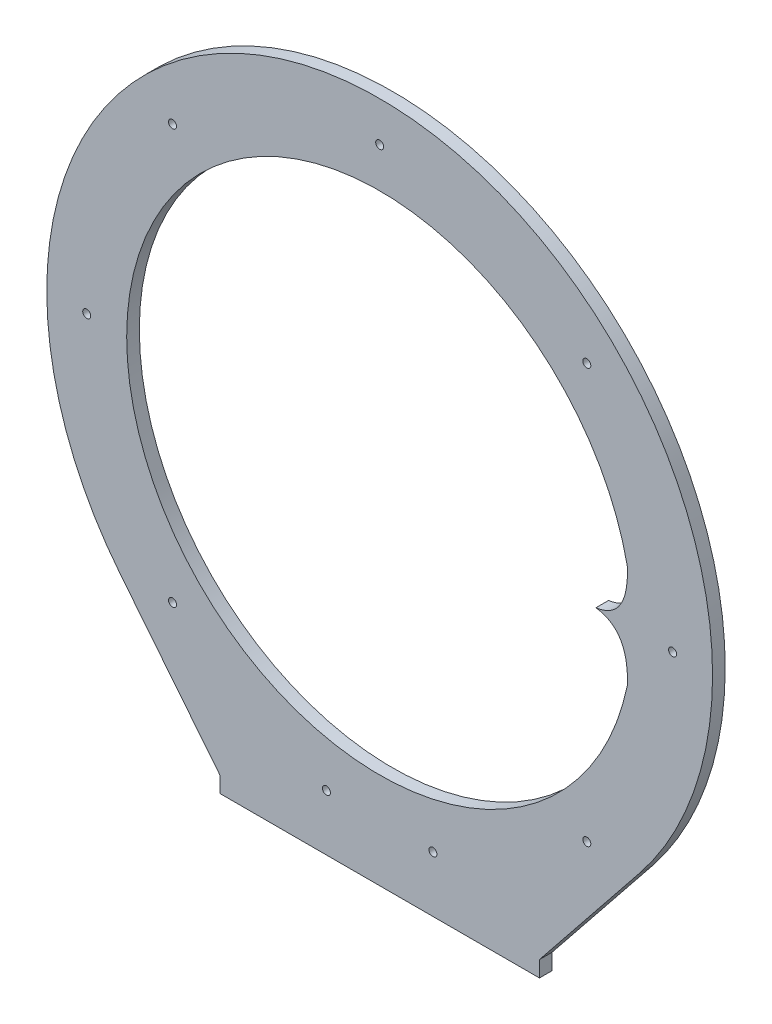
ISO-10303-21;
HEADER;
FILE_DESCRIPTION(('STEP AP214'),'2;1');
FILE_NAME('part.step','',(''),(''),'','','');
FILE_SCHEMA(('AUTOMOTIVE_DESIGN { 1 0 10303 214 1 1 1 1 }'));
ENDSEC;
DATA;
#1=APPLICATION_CONTEXT('core data for automotive mechanical design processes');
#2=APPLICATION_PROTOCOL_DEFINITION('international standard','automotive_design',2000,#1);
#3=PRODUCT_CONTEXT('',#1,'mechanical');
#4=PRODUCT('Part','Part','',(#3));
#5=PRODUCT_RELATED_PRODUCT_CATEGORY('part','',(#4));
#6=PRODUCT_DEFINITION_FORMATION('','',#4);
#7=PRODUCT_DEFINITION_CONTEXT('part definition',#1,'design');
#8=PRODUCT_DEFINITION('design','',#6,#7);
#9=PRODUCT_DEFINITION_SHAPE('','',#8);
#10=(LENGTH_UNIT() NAMED_UNIT(*) SI_UNIT(.MILLI.,.METRE.));
#11=(NAMED_UNIT(*) PLANE_ANGLE_UNIT() SI_UNIT($,.RADIAN.));
#12=(NAMED_UNIT(*) SI_UNIT($,.STERADIAN.) SOLID_ANGLE_UNIT());
#13=UNCERTAINTY_MEASURE_WITH_UNIT(LENGTH_MEASURE(1.E-05),#10,'distance_accuracy_value','');
#14=(GEOMETRIC_REPRESENTATION_CONTEXT(3) GLOBAL_UNCERTAINTY_ASSIGNED_CONTEXT((#13)) GLOBAL_UNIT_ASSIGNED_CONTEXT((#10,
#11,#12)) REPRESENTATION_CONTEXT('',''));
#15=CARTESIAN_POINT('',(0.,0.,0.));
#16=DIRECTION('',(0.,0.,1.));
#17=DIRECTION('',(1.,0.,0.));
#18=AXIS2_PLACEMENT_3D('',#15,#16,#17);
#19=CARTESIAN_POINT('',(93.0157704600136,-19.3149280539709,4.75));
#20=CARTESIAN_POINT('',(93.7028575700956,-1.72245204531406,4.75));
#21=CARTESIAN_POINT('',(81.1980074645598,0.,4.75));
#22=B_SPLINE_CURVE_WITH_KNOTS('',2,(#19,#20,#21),.UNSPECIFIED.,.F.,.F.,(3,3),(0.,1.),.UNSPECIFIED.);
#23=DIRECTION('',(0.,0.,-1.));
#24=VECTOR('',#23,1.);
#25=SURFACE_OF_LINEAR_EXTRUSION('',#22,#24);
#26=CARTESIAN_POINT('',(93.0157704600136,-19.3149280539709,0.));
#27=CARTESIAN_POINT('',(93.7028575700956,-1.72245204531406,0.));
#28=CARTESIAN_POINT('',(81.1980074645598,0.,0.));
#29=B_SPLINE_CURVE_WITH_KNOTS('',2,(#26,#27,#28),.UNSPECIFIED.,.F.,.F.,(3,3),(0.,1.),.UNSPECIFIED.);
#30=CARTESIAN_POINT('',(93.0157704600136,-19.3149280539709,0.));
#31=VERTEX_POINT('',#30);
#32=CARTESIAN_POINT('',(81.1980074645598,0.,0.));
#33=VERTEX_POINT('',#32);
#34=EDGE_CURVE('E130',#31,#33,#29,.T.);
#35=ORIENTED_EDGE('',*,*,#34,.F.);
#36=DIRECTION('',(0.,0.,-1.));
#37=VECTOR('',#36,1.);
#38=CARTESIAN_POINT('',(93.0157704600136,-19.3149280539709,4.75));
#39=LINE('',#38,#37);
#40=CARTESIAN_POINT('',(93.0157704600136,-19.3149280539709,4.75));
#41=VERTEX_POINT('',#40);
#42=EDGE_CURVE('E11',#41,#31,#39,.T.);
#43=ORIENTED_EDGE('',*,*,#42,.F.);
#44=CARTESIAN_POINT('',(81.1980074645598,0.,4.75));
#45=VERTEX_POINT('',#44);
#46=EDGE_CURVE('E128',#41,#45,#22,.T.);
#47=ORIENTED_EDGE('',*,*,#46,.T.);
#48=DIRECTION('',(0.,0.,-1.));
#49=VECTOR('',#48,1.);
#50=CARTESIAN_POINT('',(81.1980074645598,0.,4.75));
#51=LINE('',#50,#49);
#52=EDGE_CURVE('E104',#45,#33,#51,.T.);
#53=ORIENTED_EDGE('',*,*,#52,.T.);
#54=EDGE_LOOP('',(#35,#43,#47,#53));
#55=FACE_BOUND('',#54,.T.);
#56=ADVANCED_FACE('F49',(#55),#25,.T.);
#57=CARTESIAN_POINT('',(0.,0.,4.75));
#58=DIRECTION('',(0.,0.,-1.));
#59=DIRECTION('',(-1.,0.,0.));
#60=AXIS2_PLACEMENT_3D('',#57,#58,#59);
#61=CYLINDRICAL_SURFACE('',#60,95.);
#62=CARTESIAN_POINT('',(0.,0.,0.));
#63=DIRECTION('',(0.,0.,1.));
#64=DIRECTION('',(1.,0.,0.));
#65=AXIS2_PLACEMENT_3D('',#62,#63,#64);
#66=CIRCLE('',#65,95.);
#67=CARTESIAN_POINT('',(93.0157704600136,19.3149280539709,0.));
#68=VERTEX_POINT('',#67);
#69=EDGE_CURVE('E221',#68,#31,#66,.T.);
#70=ORIENTED_EDGE('',*,*,#69,.F.);
#71=DIRECTION('',(0.,0.,-1.));
#72=VECTOR('',#71,1.);
#73=CARTESIAN_POINT('',(93.0157704600136,19.3149280539709,4.75));
#74=LINE('',#73,#72);
#75=CARTESIAN_POINT('',(93.0157704600136,19.3149280539709,4.75));
#76=VERTEX_POINT('',#75);
#77=EDGE_CURVE('E59',#76,#68,#74,.T.);
#78=ORIENTED_EDGE('',*,*,#77,.F.);
#79=CARTESIAN_POINT('',(0.,0.,4.75));
#80=DIRECTION('',(0.,0.,1.));
#81=DIRECTION('',(1.,0.,0.));
#82=AXIS2_PLACEMENT_3D('',#79,#80,#81);
#83=CIRCLE('',#82,95.);
#84=EDGE_CURVE('E137',#76,#41,#83,.T.);
#85=ORIENTED_EDGE('',*,*,#84,.T.);
#86=ORIENTED_EDGE('',*,*,#42,.T.);
#87=EDGE_LOOP('',(#70,#78,#85,#86));
#88=FACE_BOUND('',#87,.T.);
#89=ADVANCED_FACE('F140',(#88),#61,.F.);
#90=CARTESIAN_POINT('',(97.5292587776334,-78.185955786736,4.75));
#91=DIRECTION('',(-0.780234070221067,0.625487646293888,0.));
#92=DIRECTION('',(-0.625487646293888,-0.780234070221067,0.));
#93=AXIS2_PLACEMENT_3D('',#90,#91,#92);
#94=PLANE('',#93);
#95=DIRECTION('',(0.625487646293888,0.780234070221067,0.));
#96=VECTOR('',#95,1.);
#97=CARTESIAN_POINT('',(97.5292587776334,-78.185955786736,0.));
#98=LINE('',#97,#96);
#99=CARTESIAN_POINT('',(60.0000000000001,-125.,0.));
#100=VERTEX_POINT('',#99);
#101=CARTESIAN_POINT('',(97.5292587776333,-78.1859557867361,0.));
#102=VERTEX_POINT('',#101);
#103=EDGE_CURVE('E200',#100,#102,#98,.T.);
#104=ORIENTED_EDGE('',*,*,#103,.T.);
#105=DIRECTION('',(0.,0.,-1.));
#106=VECTOR('',#105,1.);
#107=CARTESIAN_POINT('',(97.5292587776333,-78.1859557867361,4.75));
#108=LINE('',#107,#106);
#109=CARTESIAN_POINT('',(97.5292587776333,-78.1859557867361,4.75));
#110=VERTEX_POINT('',#109);
#111=EDGE_CURVE('E53',#110,#102,#108,.T.);
#112=ORIENTED_EDGE('',*,*,#111,.F.);
#113=DIRECTION('',(0.625487646293888,0.780234070221067,0.));
#114=VECTOR('',#113,1.);
#115=CARTESIAN_POINT('',(97.5292587776334,-78.185955786736,4.75));
#116=LINE('',#115,#114);
#117=CARTESIAN_POINT('',(60.0000000000001,-125.,4.75));
#118=VERTEX_POINT('',#117);
#119=EDGE_CURVE('E260',#118,#110,#116,.T.);
#120=ORIENTED_EDGE('',*,*,#119,.F.);
#121=DIRECTION('',(0.,0.,-1.));
#122=VECTOR('',#121,1.);
#123=CARTESIAN_POINT('',(60.0000000000001,-125.,4.75));
#124=LINE('',#123,#122);
#125=EDGE_CURVE('E263',#118,#100,#124,.T.);
#126=ORIENTED_EDGE('',*,*,#125,.T.);
#127=EDGE_LOOP('',(#104,#112,#120,#126));
#128=FACE_BOUND('',#127,.T.);
#129=ADVANCED_FACE('F51',(#128),#94,.F.);
#130=CARTESIAN_POINT('',(0.,0.,4.75));
#131=DIRECTION('',(0.,0.,-1.));
#132=DIRECTION('',(-1.,0.,0.));
#133=AXIS2_PLACEMENT_3D('',#130,#131,#132);
#134=CYLINDRICAL_SURFACE('',#133,125.);
#135=CARTESIAN_POINT('',(0.,0.,0.));
#136=DIRECTION('',(0.,0.,1.));
#137=DIRECTION('',(1.,0.,0.));
#138=AXIS2_PLACEMENT_3D('',#135,#136,#137);
#139=CIRCLE('',#138,125.);
#140=CARTESIAN_POINT('',(-97.5292587776333,-78.1859557867361,0.));
#141=VERTEX_POINT('',#140);
#142=EDGE_CURVE('E191',#102,#141,#139,.T.);
#143=ORIENTED_EDGE('',*,*,#142,.T.);
#144=DIRECTION('',(0.,0.,-1.));
#145=VECTOR('',#144,1.);
#146=CARTESIAN_POINT('',(-97.5292587776333,-78.1859557867361,4.75));
#147=LINE('',#146,#145);
#148=CARTESIAN_POINT('',(-97.5292587776333,-78.1859557867361,4.75));
#149=VERTEX_POINT('',#148);
#150=EDGE_CURVE('E193',#149,#141,#147,.T.);
#151=ORIENTED_EDGE('',*,*,#150,.F.);
#152=CARTESIAN_POINT('',(0.,0.,4.75));
#153=DIRECTION('',(0.,0.,1.));
#154=DIRECTION('',(1.,0.,0.));
#155=AXIS2_PLACEMENT_3D('',#152,#153,#154);
#156=CIRCLE('',#155,125.);
#157=EDGE_CURVE('E112',#110,#149,#156,.T.);
#158=ORIENTED_EDGE('',*,*,#157,.F.);
#159=ORIENTED_EDGE('',*,*,#111,.T.);
#160=EDGE_LOOP('',(#143,#151,#158,#159));
#161=FACE_BOUND('',#160,.T.);
#162=ADVANCED_FACE('F183',(#161),#134,.T.);
#163=CARTESIAN_POINT('',(-97.5292587776332,-78.1859557867361,4.75));
#164=DIRECTION('',(-0.780234070221066,-0.625487646293889,0.));
#165=DIRECTION('',(0.625487646293889,-0.780234070221066,0.));
#166=AXIS2_PLACEMENT_3D('',#163,#164,#165);
#167=PLANE('',#166);
#168=DIRECTION('',(-0.625487646293889,0.780234070221066,0.));
#169=VECTOR('',#168,1.);
#170=CARTESIAN_POINT('',(-97.5292587776332,-78.1859557867361,0.));
#171=LINE('',#170,#169);
#172=CARTESIAN_POINT('',(-59.9999999999999,-125.,0.));
#173=VERTEX_POINT('',#172);
#174=EDGE_CURVE('E199',#173,#141,#171,.T.);
#175=ORIENTED_EDGE('',*,*,#174,.F.);
#176=DIRECTION('',(0.,0.,-1.));
#177=VECTOR('',#176,1.);
#178=CARTESIAN_POINT('',(-59.9999999999999,-125.,4.75));
#179=LINE('',#178,#177);
#180=CARTESIAN_POINT('',(-59.9999999999999,-125.,4.75));
#181=VERTEX_POINT('',#180);
#182=EDGE_CURVE('E271',#181,#173,#179,.T.);
#183=ORIENTED_EDGE('',*,*,#182,.F.);
#184=DIRECTION('',(-0.625487646293889,0.780234070221066,0.));
#185=VECTOR('',#184,1.);
#186=CARTESIAN_POINT('',(-97.5292587776332,-78.1859557867361,4.75));
#187=LINE('',#186,#185);
#188=EDGE_CURVE('E273',#181,#149,#187,.T.);
#189=ORIENTED_EDGE('',*,*,#188,.T.);
#190=ORIENTED_EDGE('',*,*,#150,.T.);
#191=EDGE_LOOP('',(#175,#183,#189,#190));
#192=FACE_BOUND('',#191,.T.);
#193=ADVANCED_FACE('F180',(#192),#167,.T.);
#194=CARTESIAN_POINT('',(-59.9999999999999,0.,4.75));
#195=DIRECTION('',(1.,0.,0.));
#196=DIRECTION('',(0.,0.,-1.));
#197=AXIS2_PLACEMENT_3D('',#194,#195,#196);
#198=PLANE('',#197);
#199=DIRECTION('',(0.,-1.,0.));
#200=VECTOR('',#199,1.);
#201=CARTESIAN_POINT('',(-59.9999999999999,0.,0.));
#202=LINE('',#201,#200);
#203=CARTESIAN_POINT('',(-59.9999999999999,-131.,0.));
#204=VERTEX_POINT('',#203);
#205=EDGE_CURVE('E207',#173,#204,#202,.T.);
#206=ORIENTED_EDGE('',*,*,#205,.T.);
#207=DIRECTION('',(0.,0.,-1.));
#208=VECTOR('',#207,1.);
#209=CARTESIAN_POINT('',(-59.9999999999999,-131.,4.75));
#210=LINE('',#209,#208);
#211=CARTESIAN_POINT('',(-59.9999999999999,-131.,4.75));
#212=VERTEX_POINT('',#211);
#213=EDGE_CURVE('E268',#212,#204,#210,.T.);
#214=ORIENTED_EDGE('',*,*,#213,.F.);
#215=DIRECTION('',(0.,-1.,0.));
#216=VECTOR('',#215,1.);
#217=CARTESIAN_POINT('',(-59.9999999999999,0.,4.75));
#218=LINE('',#217,#216);
#219=EDGE_CURVE('E276',#181,#212,#218,.T.);
#220=ORIENTED_EDGE('',*,*,#219,.F.);
#221=ORIENTED_EDGE('',*,*,#182,.T.);
#222=EDGE_LOOP('',(#206,#214,#220,#221));
#223=FACE_BOUND('',#222,.T.);
#224=ADVANCED_FACE('F176',(#223),#198,.F.);
#225=CARTESIAN_POINT('',(0.,-131.,4.75));
#226=DIRECTION('',(0.,1.,0.));
#227=DIRECTION('',(0.,0.,1.));
#228=AXIS2_PLACEMENT_3D('',#225,#226,#227);
#229=PLANE('',#228);
#230=DIRECTION('',(1.,0.,0.));
#231=VECTOR('',#230,1.);
#232=CARTESIAN_POINT('',(0.,-131.,0.));
#233=LINE('',#232,#231);
#234=CARTESIAN_POINT('',(60.0000000000001,-131.,0.));
#235=VERTEX_POINT('',#234);
#236=EDGE_CURVE('E209',#204,#235,#233,.T.);
#237=ORIENTED_EDGE('',*,*,#236,.T.);
#238=DIRECTION('',(0.,0.,-1.));
#239=VECTOR('',#238,1.);
#240=CARTESIAN_POINT('',(60.0000000000001,-131.,4.75));
#241=LINE('',#240,#239);
#242=CARTESIAN_POINT('',(60.0000000000001,-131.,4.75));
#243=VERTEX_POINT('',#242);
#244=EDGE_CURVE('E265',#243,#235,#241,.T.);
#245=ORIENTED_EDGE('',*,*,#244,.F.);
#246=DIRECTION('',(1.,0.,0.));
#247=VECTOR('',#246,1.);
#248=CARTESIAN_POINT('',(0.,-131.,4.75));
#249=LINE('',#248,#247);
#250=EDGE_CURVE('E278',#212,#243,#249,.T.);
#251=ORIENTED_EDGE('',*,*,#250,.F.);
#252=ORIENTED_EDGE('',*,*,#213,.T.);
#253=EDGE_LOOP('',(#237,#245,#251,#252));
#254=FACE_BOUND('',#253,.T.);
#255=ADVANCED_FACE('F172',(#254),#229,.F.);
#256=CARTESIAN_POINT('',(-20.,-110.,4.75));
#257=DIRECTION('',(0.,0.,-1.));
#258=DIRECTION('',(-1.,0.,0.));
#259=AXIS2_PLACEMENT_3D('',#256,#257,#258);
#260=CYLINDRICAL_SURFACE('',#259,1.5);
#261=CARTESIAN_POINT('',(-20.,-110.,4.75));
#262=DIRECTION('',(0.,0.,1.));
#263=DIRECTION('',(1.,0.,0.));
#264=AXIS2_PLACEMENT_3D('',#261,#262,#263);
#265=CIRCLE('',#264,1.5);
#266=CARTESIAN_POINT('',(-18.5,-110.,4.75));
#267=VERTEX_POINT('',#266);
#268=EDGE_CURVE('E293',#267,#267,#265,.T.);
#269=ORIENTED_EDGE('',*,*,#268,.T.);
#270=EDGE_LOOP('',(#269));
#271=FACE_BOUND('',#270,.T.);
#272=CARTESIAN_POINT('',(-20.,-110.,0.));
#273=DIRECTION('',(0.,0.,1.));
#274=DIRECTION('',(1.,0.,0.));
#275=AXIS2_PLACEMENT_3D('',#272,#273,#274);
#276=CIRCLE('',#275,1.5);
#277=CARTESIAN_POINT('',(-18.5,-110.,0.));
#278=VERTEX_POINT('',#277);
#279=EDGE_CURVE('E254',#278,#278,#276,.T.);
#280=ORIENTED_EDGE('',*,*,#279,.F.);
#281=EDGE_LOOP('',(#280));
#282=FACE_BOUND('',#281,.T.);
#283=ADVANCED_FACE('F175',(#271,#282),#260,.F.);
#284=CARTESIAN_POINT('',(-110.,0.,4.75));
#285=DIRECTION('',(0.,0.,-1.));
#286=DIRECTION('',(-1.,0.,0.));
#287=AXIS2_PLACEMENT_3D('',#284,#285,#286);
#288=CYLINDRICAL_SURFACE('',#287,1.5);
#289=CARTESIAN_POINT('',(-110.,0.,4.75));
#290=DIRECTION('',(0.,0.,1.));
#291=DIRECTION('',(1.,0.,0.));
#292=AXIS2_PLACEMENT_3D('',#289,#290,#291);
#293=CIRCLE('',#292,1.5);
#294=CARTESIAN_POINT('',(-108.5,0.,4.75));
#295=VERTEX_POINT('',#294);
#296=EDGE_CURVE('E296',#295,#295,#293,.F.);
#297=ORIENTED_EDGE('',*,*,#296,.F.);
#298=EDGE_LOOP('',(#297));
#299=FACE_BOUND('',#298,.T.);
#300=CARTESIAN_POINT('',(-110.,0.,0.));
#301=DIRECTION('',(0.,0.,1.));
#302=DIRECTION('',(1.,0.,0.));
#303=AXIS2_PLACEMENT_3D('',#300,#301,#302);
#304=CIRCLE('',#303,1.5);
#305=CARTESIAN_POINT('',(-108.5,0.,0.));
#306=VERTEX_POINT('',#305);
#307=EDGE_CURVE('E251',#306,#306,#304,.F.);
#308=ORIENTED_EDGE('',*,*,#307,.T.);
#309=EDGE_LOOP('',(#308));
#310=FACE_BOUND('',#309,.T.);
#311=ADVANCED_FACE('F352',(#299,#310),#288,.F.);
#312=CARTESIAN_POINT('',(110.,0.,4.75));
#313=DIRECTION('',(0.,0.,-1.));
#314=DIRECTION('',(-1.,0.,0.));
#315=AXIS2_PLACEMENT_3D('',#312,#313,#314);
#316=CYLINDRICAL_SURFACE('',#315,1.5);
#317=CARTESIAN_POINT('',(110.,0.,4.75));
#318=DIRECTION('',(0.,0.,1.));
#319=DIRECTION('',(1.,0.,0.));
#320=AXIS2_PLACEMENT_3D('',#317,#318,#319);
#321=CIRCLE('',#320,1.5);
#322=CARTESIAN_POINT('',(111.5,0.,4.75));
#323=VERTEX_POINT('',#322);
#324=EDGE_CURVE('E299',#323,#323,#321,.T.);
#325=ORIENTED_EDGE('',*,*,#324,.T.);
#326=EDGE_LOOP('',(#325));
#327=FACE_BOUND('',#326,.T.);
#328=CARTESIAN_POINT('',(110.,0.,0.));
#329=DIRECTION('',(0.,0.,1.));
#330=DIRECTION('',(1.,0.,0.));
#331=AXIS2_PLACEMENT_3D('',#328,#329,#330);
#332=CIRCLE('',#331,1.5);
#333=CARTESIAN_POINT('',(111.5,0.,0.));
#334=VERTEX_POINT('',#333);
#335=EDGE_CURVE('E248',#334,#334,#332,.T.);
#336=ORIENTED_EDGE('',*,*,#335,.F.);
#337=EDGE_LOOP('',(#336));
#338=FACE_BOUND('',#337,.T.);
#339=ADVANCED_FACE('F356',(#327,#338),#316,.F.);
#340=CARTESIAN_POINT('',(0.,110.,4.75));
#341=DIRECTION('',(0.,0.,-1.));
#342=DIRECTION('',(-1.,0.,0.));
#343=AXIS2_PLACEMENT_3D('',#340,#341,#342);
#344=CYLINDRICAL_SURFACE('',#343,1.5);
#345=CARTESIAN_POINT('',(0.,110.,4.75));
#346=DIRECTION('',(0.,0.,1.));
#347=DIRECTION('',(1.,0.,0.));
#348=AXIS2_PLACEMENT_3D('',#345,#346,#347);
#349=CIRCLE('',#348,1.5);
#350=CARTESIAN_POINT('',(1.5,110.,4.75));
#351=VERTEX_POINT('',#350);
#352=EDGE_CURVE('E302',#351,#351,#349,.F.);
#353=ORIENTED_EDGE('',*,*,#352,.F.);
#354=EDGE_LOOP('',(#353));
#355=FACE_BOUND('',#354,.T.);
#356=CARTESIAN_POINT('',(0.,110.,0.));
#357=DIRECTION('',(0.,0.,1.));
#358=DIRECTION('',(1.,0.,0.));
#359=AXIS2_PLACEMENT_3D('',#356,#357,#358);
#360=CIRCLE('',#359,1.5);
#361=CARTESIAN_POINT('',(1.5,110.,0.));
#362=VERTEX_POINT('',#361);
#363=EDGE_CURVE('E245',#362,#362,#360,.F.);
#364=ORIENTED_EDGE('',*,*,#363,.T.);
#365=EDGE_LOOP('',(#364));
#366=FACE_BOUND('',#365,.T.);
#367=ADVANCED_FACE('F360',(#355,#366),#344,.F.);
#368=CARTESIAN_POINT('',(77.7817459305203,-77.7817459305202,4.75));
#369=DIRECTION('',(0.,0.,-1.));
#370=DIRECTION('',(-1.,0.,0.));
#371=AXIS2_PLACEMENT_3D('',#368,#369,#370);
#372=CYLINDRICAL_SURFACE('',#371,1.5);
#373=CARTESIAN_POINT('',(77.7817459305203,-77.7817459305202,4.75));
#374=DIRECTION('',(0.,0.,1.));
#375=DIRECTION('',(1.,0.,0.));
#376=AXIS2_PLACEMENT_3D('',#373,#374,#375);
#377=CIRCLE('',#376,1.5);
#378=CARTESIAN_POINT('',(79.2817459305203,-77.7817459305202,4.75));
#379=VERTEX_POINT('',#378);
#380=EDGE_CURVE('E305',#379,#379,#377,.T.);
#381=ORIENTED_EDGE('',*,*,#380,.T.);
#382=EDGE_LOOP('',(#381));
#383=FACE_BOUND('',#382,.T.);
#384=CARTESIAN_POINT('',(77.7817459305203,-77.7817459305202,0.));
#385=DIRECTION('',(0.,0.,1.));
#386=DIRECTION('',(1.,0.,0.));
#387=AXIS2_PLACEMENT_3D('',#384,#385,#386);
#388=CIRCLE('',#387,1.5);
#389=CARTESIAN_POINT('',(79.2817459305203,-77.7817459305202,0.));
#390=VERTEX_POINT('',#389);
#391=EDGE_CURVE('E242',#390,#390,#388,.T.);
#392=ORIENTED_EDGE('',*,*,#391,.F.);
#393=EDGE_LOOP('',(#392));
#394=FACE_BOUND('',#393,.T.);
#395=ADVANCED_FACE('F364',(#383,#394),#372,.F.);
#396=CARTESIAN_POINT('',(77.7817459305202,77.7817459305202,4.75));
#397=DIRECTION('',(0.,0.,-1.));
#398=DIRECTION('',(-1.,0.,0.));
#399=AXIS2_PLACEMENT_3D('',#396,#397,#398);
#400=CYLINDRICAL_SURFACE('',#399,1.5);
#401=CARTESIAN_POINT('',(77.7817459305202,77.7817459305202,4.75));
#402=DIRECTION('',(0.,0.,1.));
#403=DIRECTION('',(1.,0.,0.));
#404=AXIS2_PLACEMENT_3D('',#401,#402,#403);
#405=CIRCLE('',#404,1.5);
#406=CARTESIAN_POINT('',(79.2817459305202,77.7817459305202,4.75));
#407=VERTEX_POINT('',#406);
#408=EDGE_CURVE('E308',#407,#407,#405,.T.);
#409=ORIENTED_EDGE('',*,*,#408,.T.);
#410=EDGE_LOOP('',(#409));
#411=FACE_BOUND('',#410,.T.);
#412=CARTESIAN_POINT('',(77.7817459305202,77.7817459305202,0.));
#413=DIRECTION('',(0.,0.,1.));
#414=DIRECTION('',(1.,0.,0.));
#415=AXIS2_PLACEMENT_3D('',#412,#413,#414);
#416=CIRCLE('',#415,1.5);
#417=CARTESIAN_POINT('',(79.2817459305202,77.7817459305202,0.));
#418=VERTEX_POINT('',#417);
#419=EDGE_CURVE('E239',#418,#418,#416,.T.);
#420=ORIENTED_EDGE('',*,*,#419,.F.);
#421=EDGE_LOOP('',(#420));
#422=FACE_BOUND('',#421,.T.);
#423=ADVANCED_FACE('F368',(#411,#422),#400,.F.);
#424=CARTESIAN_POINT('',(-77.7817459305202,-77.7817459305202,4.75));
#425=DIRECTION('',(0.,0.,-1.));
#426=DIRECTION('',(-1.,0.,0.));
#427=AXIS2_PLACEMENT_3D('',#424,#425,#426);
#428=CYLINDRICAL_SURFACE('',#427,1.49999999999997);
#429=CARTESIAN_POINT('',(-77.7817459305202,-77.7817459305202,4.75));
#430=DIRECTION('',(0.,0.,1.));
#431=DIRECTION('',(1.,0.,0.));
#432=AXIS2_PLACEMENT_3D('',#429,#430,#431);
#433=CIRCLE('',#432,1.49999999999997);
#434=CARTESIAN_POINT('',(-76.2817459305202,-77.7817459305202,4.75));
#435=VERTEX_POINT('',#434);
#436=EDGE_CURVE('E310',#435,#435,#433,.F.);
#437=ORIENTED_EDGE('',*,*,#436,.F.);
#438=EDGE_LOOP('',(#437));
#439=FACE_BOUND('',#438,.T.);
#440=CARTESIAN_POINT('',(-77.7817459305202,-77.7817459305202,0.));
#441=DIRECTION('',(0.,0.,1.));
#442=DIRECTION('',(1.,0.,0.));
#443=AXIS2_PLACEMENT_3D('',#440,#441,#442);
#444=CIRCLE('',#443,1.49999999999997);
#445=CARTESIAN_POINT('',(-76.2817459305202,-77.7817459305202,0.));
#446=VERTEX_POINT('',#445);
#447=EDGE_CURVE('E236',#446,#446,#444,.F.);
#448=ORIENTED_EDGE('',*,*,#447,.T.);
#449=EDGE_LOOP('',(#448));
#450=FACE_BOUND('',#449,.T.);
#451=ADVANCED_FACE('F319',(#439,#450),#428,.F.);
#452=CARTESIAN_POINT('',(-77.7817459305202,77.7817459305202,4.75));
#453=DIRECTION('',(0.,0.,-1.));
#454=DIRECTION('',(-1.,0.,0.));
#455=AXIS2_PLACEMENT_3D('',#452,#453,#454);
#456=CYLINDRICAL_SURFACE('',#455,1.49999999999998);
#457=CARTESIAN_POINT('',(-77.7817459305202,77.7817459305202,4.75));
#458=DIRECTION('',(0.,0.,1.));
#459=DIRECTION('',(1.,0.,0.));
#460=AXIS2_PLACEMENT_3D('',#457,#458,#459);
#461=CIRCLE('',#460,1.49999999999998);
#462=CARTESIAN_POINT('',(-76.2817459305202,77.7817459305202,4.75));
#463=VERTEX_POINT('',#462);
#464=EDGE_CURVE('E142',#463,#463,#461,.F.);
#465=ORIENTED_EDGE('',*,*,#464,.F.);
#466=EDGE_LOOP('',(#465));
#467=FACE_BOUND('',#466,.T.);
#468=CARTESIAN_POINT('',(-77.7817459305202,77.7817459305202,0.));
#469=DIRECTION('',(0.,0.,1.));
#470=DIRECTION('',(1.,0.,0.));
#471=AXIS2_PLACEMENT_3D('',#468,#469,#470);
#472=CIRCLE('',#471,1.49999999999998);
#473=CARTESIAN_POINT('',(-76.2817459305202,77.7817459305202,0.));
#474=VERTEX_POINT('',#473);
#475=EDGE_CURVE('E230',#474,#474,#472,.F.);
#476=ORIENTED_EDGE('',*,*,#475,.T.);
#477=EDGE_LOOP('',(#476));
#478=FACE_BOUND('',#477,.T.);
#479=ADVANCED_FACE('F162',(#467,#478),#456,.F.);
#480=CARTESIAN_POINT('',(93.0157704600136,19.3149280539709,4.75));
#481=CARTESIAN_POINT('',(93.7028575700956,1.72245204531406,4.75));
#482=CARTESIAN_POINT('',(81.1980074645598,0.,4.75));
#483=B_SPLINE_CURVE_WITH_KNOTS('',2,(#480,#481,#482),.UNSPECIFIED.,.F.,.F.,(3,3),(0.,1.),.UNSPECIFIED.);
#484=DIRECTION('',(0.,0.,-1.));
#485=VECTOR('',#484,1.);
#486=SURFACE_OF_LINEAR_EXTRUSION('',#483,#485);
#487=CARTESIAN_POINT('',(93.0157704600136,19.3149280539709,0.));
#488=CARTESIAN_POINT('',(93.7028575700956,1.72245204531406,0.));
#489=CARTESIAN_POINT('',(81.1980074645598,0.,0.));
#490=B_SPLINE_CURVE_WITH_KNOTS('',2,(#487,#488,#489),.UNSPECIFIED.,.F.,.F.,(3,3),(0.,1.),.UNSPECIFIED.);
#491=EDGE_CURVE('E226',#68,#33,#490,.T.);
#492=ORIENTED_EDGE('',*,*,#491,.T.);
#493=ORIENTED_EDGE('',*,*,#52,.F.);
#494=EDGE_CURVE('E68',#76,#45,#483,.T.);
#495=ORIENTED_EDGE('',*,*,#494,.F.);
#496=ORIENTED_EDGE('',*,*,#77,.T.);
#497=EDGE_LOOP('',(#492,#493,#495,#496));
#498=FACE_BOUND('',#497,.T.);
#499=ADVANCED_FACE('F157',(#498),#486,.F.);
#500=CARTESIAN_POINT('',(60.0000000000001,0.,4.75));
#501=DIRECTION('',(1.,0.,0.));
#502=DIRECTION('',(0.,0.,-1.));
#503=AXIS2_PLACEMENT_3D('',#500,#501,#502);
#504=PLANE('',#503);
#505=DIRECTION('',(0.,-1.,0.));
#506=VECTOR('',#505,1.);
#507=CARTESIAN_POINT('',(60.0000000000001,0.,0.));
#508=LINE('',#507,#506);
#509=EDGE_CURVE('E215',#100,#235,#508,.T.);
#510=ORIENTED_EDGE('',*,*,#509,.F.);
#511=ORIENTED_EDGE('',*,*,#125,.F.);
#512=DIRECTION('',(0.,-1.,0.));
#513=VECTOR('',#512,1.);
#514=CARTESIAN_POINT('',(60.0000000000001,0.,4.75));
#515=LINE('',#514,#513);
#516=EDGE_CURVE('E138',#118,#243,#515,.T.);
#517=ORIENTED_EDGE('',*,*,#516,.T.);
#518=ORIENTED_EDGE('',*,*,#244,.T.);
#519=EDGE_LOOP('',(#510,#511,#517,#518));
#520=FACE_BOUND('',#519,.T.);
#521=ADVANCED_FACE('F161',(#520),#504,.T.);
#522=CARTESIAN_POINT('',(20.,-110.,4.75));
#523=DIRECTION('',(0.,0.,-1.));
#524=DIRECTION('',(-1.,0.,0.));
#525=AXIS2_PLACEMENT_3D('',#522,#523,#524);
#526=CYLINDRICAL_SURFACE('',#525,1.5);
#527=CARTESIAN_POINT('',(20.,-110.,4.75));
#528=DIRECTION('',(0.,0.,1.));
#529=DIRECTION('',(1.,0.,0.));
#530=AXIS2_PLACEMENT_3D('',#527,#528,#529);
#531=CIRCLE('',#530,1.5);
#532=CARTESIAN_POINT('',(21.5,-110.,4.75));
#533=VERTEX_POINT('',#532);
#534=EDGE_CURVE('E266',#533,#533,#531,.F.);
#535=ORIENTED_EDGE('',*,*,#534,.F.);
#536=EDGE_LOOP('',(#535));
#537=FACE_BOUND('',#536,.T.);
#538=CARTESIAN_POINT('',(20.,-110.,0.));
#539=DIRECTION('',(0.,0.,1.));
#540=DIRECTION('',(1.,0.,0.));
#541=AXIS2_PLACEMENT_3D('',#538,#539,#540);
#542=CIRCLE('',#541,1.5);
#543=CARTESIAN_POINT('',(21.5,-110.,0.));
#544=VERTEX_POINT('',#543);
#545=EDGE_CURVE('E257',#544,#544,#542,.F.);
#546=ORIENTED_EDGE('',*,*,#545,.T.);
#547=EDGE_LOOP('',(#546));
#548=FACE_BOUND('',#547,.T.);
#549=ADVANCED_FACE('F170',(#537,#548),#526,.F.);
#550=CARTESIAN_POINT('',(0.,0.,4.75));
#551=DIRECTION('',(0.,0.,1.));
#552=DIRECTION('',(1.,0.,0.));
#553=AXIS2_PLACEMENT_3D('',#550,#551,#552);
#554=PLANE('',#553);
#555=ORIENTED_EDGE('',*,*,#119,.T.);
#556=ORIENTED_EDGE('',*,*,#157,.T.);
#557=ORIENTED_EDGE('',*,*,#188,.F.);
#558=ORIENTED_EDGE('',*,*,#219,.T.);
#559=ORIENTED_EDGE('',*,*,#250,.T.);
#560=ORIENTED_EDGE('',*,*,#516,.F.);
#561=EDGE_LOOP('',(#555,#556,#557,#558,#559,#560));
#562=FACE_BOUND('',#561,.T.);
#563=ORIENTED_EDGE('',*,*,#46,.F.);
#564=ORIENTED_EDGE('',*,*,#84,.F.);
#565=ORIENTED_EDGE('',*,*,#494,.T.);
#566=EDGE_LOOP('',(#563,#564,#565));
#567=FACE_BOUND('',#566,.T.);
#568=ORIENTED_EDGE('',*,*,#464,.T.);
#569=EDGE_LOOP('',(#568));
#570=FACE_BOUND('',#569,.T.);
#571=ORIENTED_EDGE('',*,*,#436,.T.);
#572=EDGE_LOOP('',(#571));
#573=FACE_BOUND('',#572,.T.);
#574=ORIENTED_EDGE('',*,*,#408,.F.);
#575=EDGE_LOOP('',(#574));
#576=FACE_BOUND('',#575,.T.);
#577=ORIENTED_EDGE('',*,*,#380,.F.);
#578=EDGE_LOOP('',(#577));
#579=FACE_BOUND('',#578,.T.);
#580=ORIENTED_EDGE('',*,*,#352,.T.);
#581=EDGE_LOOP('',(#580));
#582=FACE_BOUND('',#581,.T.);
#583=ORIENTED_EDGE('',*,*,#324,.F.);
#584=EDGE_LOOP('',(#583));
#585=FACE_BOUND('',#584,.T.);
#586=ORIENTED_EDGE('',*,*,#296,.T.);
#587=EDGE_LOOP('',(#586));
#588=FACE_BOUND('',#587,.T.);
#589=ORIENTED_EDGE('',*,*,#268,.F.);
#590=EDGE_LOOP('',(#589));
#591=FACE_BOUND('',#590,.T.);
#592=ORIENTED_EDGE('',*,*,#534,.T.);
#593=EDGE_LOOP('',(#592));
#594=FACE_BOUND('',#593,.T.);
#595=ADVANCED_FACE('F135',(#562,#567,#570,#573,#576,#579,#582,#585,#588,#591,#594),#554,.T.);
#596=CARTESIAN_POINT('',(0.,0.,0.));
#597=DIRECTION('',(0.,0.,1.));
#598=DIRECTION('',(1.,0.,0.));
#599=AXIS2_PLACEMENT_3D('',#596,#597,#598);
#600=PLANE('',#599);
#601=ORIENTED_EDGE('',*,*,#103,.F.);
#602=ORIENTED_EDGE('',*,*,#509,.T.);
#603=ORIENTED_EDGE('',*,*,#236,.F.);
#604=ORIENTED_EDGE('',*,*,#205,.F.);
#605=ORIENTED_EDGE('',*,*,#174,.T.);
#606=ORIENTED_EDGE('',*,*,#142,.F.);
#607=EDGE_LOOP('',(#601,#602,#603,#604,#605,#606));
#608=FACE_BOUND('',#607,.T.);
#609=ORIENTED_EDGE('',*,*,#34,.T.);
#610=ORIENTED_EDGE('',*,*,#491,.F.);
#611=ORIENTED_EDGE('',*,*,#69,.T.);
#612=EDGE_LOOP('',(#609,#610,#611));
#613=FACE_BOUND('',#612,.T.);
#614=ORIENTED_EDGE('',*,*,#475,.F.);
#615=EDGE_LOOP('',(#614));
#616=FACE_BOUND('',#615,.T.);
#617=ORIENTED_EDGE('',*,*,#447,.F.);
#618=EDGE_LOOP('',(#617));
#619=FACE_BOUND('',#618,.T.);
#620=ORIENTED_EDGE('',*,*,#419,.T.);
#621=EDGE_LOOP('',(#620));
#622=FACE_BOUND('',#621,.T.);
#623=ORIENTED_EDGE('',*,*,#391,.T.);
#624=EDGE_LOOP('',(#623));
#625=FACE_BOUND('',#624,.T.);
#626=ORIENTED_EDGE('',*,*,#363,.F.);
#627=EDGE_LOOP('',(#626));
#628=FACE_BOUND('',#627,.T.);
#629=ORIENTED_EDGE('',*,*,#335,.T.);
#630=EDGE_LOOP('',(#629));
#631=FACE_BOUND('',#630,.T.);
#632=ORIENTED_EDGE('',*,*,#307,.F.);
#633=EDGE_LOOP('',(#632));
#634=FACE_BOUND('',#633,.T.);
#635=ORIENTED_EDGE('',*,*,#279,.T.);
#636=EDGE_LOOP('',(#635));
#637=FACE_BOUND('',#636,.T.);
#638=ORIENTED_EDGE('',*,*,#545,.F.);
#639=EDGE_LOOP('',(#638));
#640=FACE_BOUND('',#639,.T.);
#641=ADVANCED_FACE('F204',(#608,#613,#616,#619,#622,#625,#628,#631,#634,#637,#640),#600,.F.);
#642=CLOSED_SHELL('',(#56,#89,#129,#162,#193,#224,#255,#283,#311,#339,#367,#395,#423,#451,#479,
#499,#521,#549,#595,#641));
#643=MANIFOLD_SOLID_BREP('B2',#642);
#644=ADVANCED_BREP_SHAPE_REPRESENTATION('',(#18,#643),#14);
#645=SHAPE_DEFINITION_REPRESENTATION(#9,#644);
ENDSEC;
END-ISO-10303-21;
